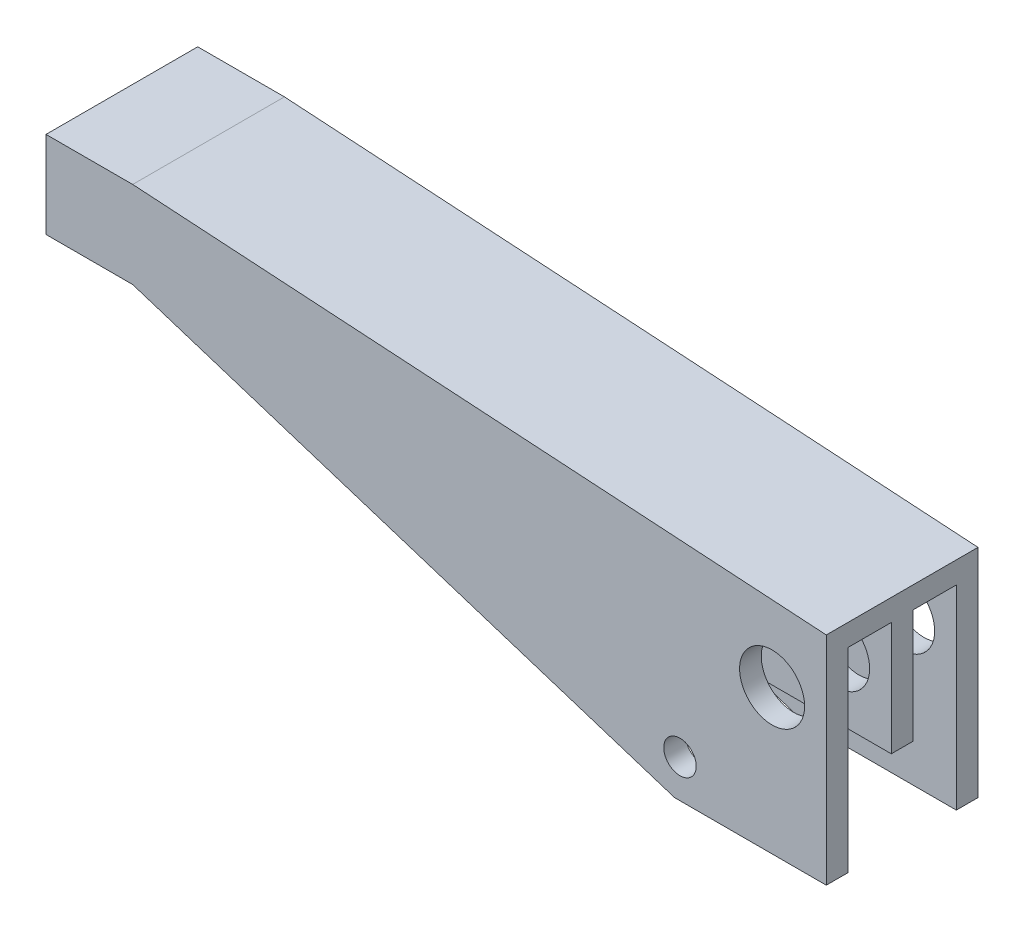
ISO-10303-21;
HEADER;
FILE_DESCRIPTION(('STEP AP214'),'2;1');
FILE_NAME('part.step','',(''),(''),'','','');
FILE_SCHEMA(('AUTOMOTIVE_DESIGN { 1 0 10303 214 1 1 1 1 }'));
ENDSEC;
DATA;
#1=APPLICATION_CONTEXT('core data for automotive mechanical design processes');
#2=APPLICATION_PROTOCOL_DEFINITION('international standard','automotive_design',2000,#1);
#3=PRODUCT_CONTEXT('',#1,'mechanical');
#4=PRODUCT('Part','Part','',(#3));
#5=PRODUCT_RELATED_PRODUCT_CATEGORY('part','',(#4));
#6=PRODUCT_DEFINITION_FORMATION('','',#4);
#7=PRODUCT_DEFINITION_CONTEXT('part definition',#1,'design');
#8=PRODUCT_DEFINITION('design','',#6,#7);
#9=PRODUCT_DEFINITION_SHAPE('','',#8);
#10=(LENGTH_UNIT() NAMED_UNIT(*) SI_UNIT(.MILLI.,.METRE.));
#11=(NAMED_UNIT(*) PLANE_ANGLE_UNIT() SI_UNIT($,.RADIAN.));
#12=(NAMED_UNIT(*) SI_UNIT($,.STERADIAN.) SOLID_ANGLE_UNIT());
#13=UNCERTAINTY_MEASURE_WITH_UNIT(LENGTH_MEASURE(1.E-05),#10,'distance_accuracy_value','');
#14=(GEOMETRIC_REPRESENTATION_CONTEXT(3) GLOBAL_UNCERTAINTY_ASSIGNED_CONTEXT((#13)) GLOBAL_UNIT_ASSIGNED_CONTEXT((#10,
#11,#12)) REPRESENTATION_CONTEXT('',''));
#15=CARTESIAN_POINT('',(0.,0.,0.));
#16=DIRECTION('',(0.,0.,1.));
#17=DIRECTION('',(1.,0.,0.));
#18=AXIS2_PLACEMENT_3D('',#15,#16,#17);
#19=CARTESIAN_POINT('',(-25.4,230.137938977263,-917.57362405213));
#20=DIRECTION('',(-0.0623782861551791,-0.998052578482889,0.));
#21=DIRECTION('',(0.998052578482889,-0.0623782861551791,0.));
#22=AXIS2_PLACEMENT_3D('',#19,#20,#21);
#23=PLANE('',#22);
#24=DIRECTION('',(0.,0.,1.));
#25=VECTOR('',#24,1.);
#26=CARTESIAN_POINT('',(0.,228.550438977263,-917.57362405213));
#27=LINE('',#26,#25);
#28=CARTESIAN_POINT('',(0.,228.550438977263,0.));
#29=VERTEX_POINT('',#28);
#30=CARTESIAN_POINT('',(0.,228.550438977263,50.8));
#31=VERTEX_POINT('',#30);
#32=EDGE_CURVE('E269',#29,#31,#27,.T.);
#33=ORIENTED_EDGE('',*,*,#32,.T.);
#34=DIRECTION('',(-0.998052578482889,0.0623782861551791,0.));
#35=VECTOR('',#34,1.);
#36=CARTESIAN_POINT('',(-25.4,230.137938977263,50.8));
#37=LINE('',#36,#35);
#38=CARTESIAN_POINT('',(-813.592976363787,279.4,50.8));
#39=VERTEX_POINT('',#38);
#40=EDGE_CURVE('E227',#31,#39,#37,.T.);
#41=ORIENTED_EDGE('',*,*,#40,.T.);
#42=DIRECTION('',(0.,0.,1.));
#43=VECTOR('',#42,1.);
#44=CARTESIAN_POINT('',(-813.592976363787,279.4,-917.57362405213));
#45=LINE('',#44,#43);
#46=CARTESIAN_POINT('',(-813.592976363787,279.4,0.));
#47=VERTEX_POINT('',#46);
#48=EDGE_CURVE('E287',#47,#39,#45,.T.);
#49=ORIENTED_EDGE('',*,*,#48,.F.);
#50=DIRECTION('',(-0.998052578482889,0.0623782861551791,0.));
#51=VECTOR('',#50,1.);
#52=CARTESIAN_POINT('',(-25.4,230.137938977263,0.));
#53=LINE('',#52,#51);
#54=EDGE_CURVE('E268',#29,#47,#53,.T.);
#55=ORIENTED_EDGE('',*,*,#54,.F.);
#56=EDGE_LOOP('',(#33,#41,#49,#55));
#57=FACE_BOUND('',#56,.T.);
#58=ADVANCED_FACE('F35',(#57),#23,.T.);
#59=CARTESIAN_POINT('',(-813.592976363787,279.4,-917.57362405213));
#60=DIRECTION('',(0.,-1.,0.));
#61=DIRECTION('',(1.,0.,0.));
#62=AXIS2_PLACEMENT_3D('',#59,#60,#61);
#63=PLANE('',#62);
#64=ORIENTED_EDGE('',*,*,#48,.T.);
#65=DIRECTION('',(-1.,0.,0.));
#66=VECTOR('',#65,1.);
#67=CARTESIAN_POINT('',(-813.592976363787,279.4,50.8));
#68=LINE('',#67,#66);
#69=CARTESIAN_POINT('',(-914.4,279.4,50.8));
#70=VERTEX_POINT('',#69);
#71=EDGE_CURVE('E225',#39,#70,#68,.T.);
#72=ORIENTED_EDGE('',*,*,#71,.T.);
#73=DIRECTION('',(0.,0.,1.));
#74=VECTOR('',#73,1.);
#75=CARTESIAN_POINT('',(-914.4,279.4,-917.57362405213));
#76=LINE('',#75,#74);
#77=CARTESIAN_POINT('',(-914.4,279.4,0.));
#78=VERTEX_POINT('',#77);
#79=EDGE_CURVE('E291',#78,#70,#76,.T.);
#80=ORIENTED_EDGE('',*,*,#79,.F.);
#81=DIRECTION('',(-1.,0.,0.));
#82=VECTOR('',#81,1.);
#83=CARTESIAN_POINT('',(-813.592976363787,279.4,0.));
#84=LINE('',#83,#82);
#85=EDGE_CURVE('E265',#47,#78,#84,.T.);
#86=ORIENTED_EDGE('',*,*,#85,.F.);
#87=EDGE_LOOP('',(#64,#72,#80,#86));
#88=FACE_BOUND('',#87,.T.);
#89=ADVANCED_FACE('F354',(#88),#63,.T.);
#90=DIRECTION('',(-0.998052578482889,0.0623782861551791,0.));
#91=VECTOR('',#90,1.);
#92=CARTESIAN_POINT('',(-25.4,230.137938977263,76.2));
#93=LINE('',#92,#91);
#94=CARTESIAN_POINT('',(0.,228.550438977263,76.1999999999999));
#95=VERTEX_POINT('',#94);
#96=CARTESIAN_POINT('',(-813.592976363787,279.4,76.2));
#97=VERTEX_POINT('',#96);
#98=EDGE_CURVE('E222',#95,#97,#93,.T.);
#99=ORIENTED_EDGE('',*,*,#98,.F.);
#100=CARTESIAN_POINT('',(0.,228.550438977263,127.));
#101=VERTEX_POINT('',#100);
#102=EDGE_CURVE('E286',#95,#101,#27,.T.);
#103=ORIENTED_EDGE('',*,*,#102,.T.);
#104=DIRECTION('',(-0.998052578482889,0.0623782861551791,0.));
#105=VECTOR('',#104,1.);
#106=CARTESIAN_POINT('',(-25.4,230.137938977263,127.));
#107=LINE('',#106,#105);
#108=CARTESIAN_POINT('',(-813.592976363787,279.4,127.));
#109=VERTEX_POINT('',#108);
#110=EDGE_CURVE('E261',#101,#109,#107,.T.);
#111=ORIENTED_EDGE('',*,*,#110,.T.);
#112=EDGE_CURVE('E290',#97,#109,#45,.T.);
#113=ORIENTED_EDGE('',*,*,#112,.F.);
#114=EDGE_LOOP('',(#99,#103,#111,#113));
#115=FACE_BOUND('',#114,.T.);
#116=ADVANCED_FACE('F409',(#115),#23,.T.);
#117=DIRECTION('',(-1.,0.,0.));
#118=VECTOR('',#117,1.);
#119=CARTESIAN_POINT('',(-813.592976363787,279.4,76.2));
#120=LINE('',#119,#118);
#121=CARTESIAN_POINT('',(-914.4,279.4,76.2));
#122=VERTEX_POINT('',#121);
#123=EDGE_CURVE('E59',#97,#122,#120,.T.);
#124=ORIENTED_EDGE('',*,*,#123,.F.);
#125=ORIENTED_EDGE('',*,*,#112,.T.);
#126=DIRECTION('',(-1.,0.,0.));
#127=VECTOR('',#126,1.);
#128=CARTESIAN_POINT('',(-813.592976363787,279.4,127.));
#129=LINE('',#128,#127);
#130=CARTESIAN_POINT('',(-914.4,279.4,127.));
#131=VERTEX_POINT('',#130);
#132=EDGE_CURVE('E11',#109,#131,#129,.T.);
#133=ORIENTED_EDGE('',*,*,#132,.T.);
#134=EDGE_CURVE('E283',#122,#131,#76,.T.);
#135=ORIENTED_EDGE('',*,*,#134,.F.);
#136=EDGE_LOOP('',(#124,#125,#133,#135));
#137=FACE_BOUND('',#136,.T.);
#138=ADVANCED_FACE('F401',(#137),#63,.T.);
#139=CARTESIAN_POINT('',(0.,0.,0.));
#140=DIRECTION('',(0.,0.,1.));
#141=DIRECTION('',(1.,0.,0.));
#142=AXIS2_PLACEMENT_3D('',#139,#140,#141);
#143=PLANE('',#142);
#144=CARTESIAN_POINT('',(-171.45,44.45,0.));
#145=DIRECTION('',(0.,0.,1.));
#146=DIRECTION('',(1.,0.,0.));
#147=AXIS2_PLACEMENT_3D('',#144,#145,#146);
#148=CIRCLE('',#147,19.05);
#149=CARTESIAN_POINT('',(-152.4,44.45,0.));
#150=VERTEX_POINT('',#149);
#151=EDGE_CURVE('E380',#150,#150,#148,.T.);
#152=ORIENTED_EDGE('',*,*,#151,.F.);
#153=EDGE_LOOP('',(#152));
#154=FACE_BOUND('',#153,.T.);
#155=CARTESIAN_POINT('',(-63.5,168.969627954527,0.));
#156=DIRECTION('',(0.,0.,1.));
#157=DIRECTION('',(1.,0.,0.));
#158=AXIS2_PLACEMENT_3D('',#155,#156,#157);
#159=CIRCLE('',#158,38.1);
#160=CARTESIAN_POINT('',(-25.4,168.969627954527,0.));
#161=VERTEX_POINT('',#160);
#162=EDGE_CURVE('E203',#161,#161,#159,.T.);
#163=ORIENTED_EDGE('',*,*,#162,.F.);
#164=EDGE_LOOP('',(#163));
#165=FACE_BOUND('',#164,.T.);
#166=DIRECTION('',(0.,1.,0.));
#167=VECTOR('',#166,1.);
#168=CARTESIAN_POINT('',(0.,0.,0.));
#169=LINE('',#168,#167);
#170=CARTESIAN_POINT('',(0.,0.,0.));
#171=VERTEX_POINT('',#170);
#172=EDGE_CURVE('E298',#171,#29,#169,.T.);
#173=ORIENTED_EDGE('',*,*,#172,.T.);
#174=ORIENTED_EDGE('',*,*,#54,.T.);
#175=ORIENTED_EDGE('',*,*,#85,.T.);
#176=DIRECTION('',(0.,-1.,0.));
#177=VECTOR('',#176,1.);
#178=CARTESIAN_POINT('',(-914.4,304.8,0.));
#179=LINE('',#178,#177);
#180=CARTESIAN_POINT('',(-914.4,203.2,0.));
#181=VERTEX_POINT('',#180);
#182=EDGE_CURVE('E272',#78,#181,#179,.T.);
#183=ORIENTED_EDGE('',*,*,#182,.T.);
#184=DIRECTION('',(1.,0.,0.));
#185=VECTOR('',#184,1.);
#186=CARTESIAN_POINT('',(-914.4,203.2,0.));
#187=LINE('',#186,#185);
#188=CARTESIAN_POINT('',(-812.8,203.2,0.));
#189=VERTEX_POINT('',#188);
#190=EDGE_CURVE('E318',#181,#189,#187,.T.);
#191=ORIENTED_EDGE('',*,*,#190,.T.);
#192=DIRECTION('',(0.952424147199324,-0.304775727103784,0.));
#193=VECTOR('',#192,1.);
#194=CARTESIAN_POINT('',(-812.8,203.2,0.));
#195=LINE('',#194,#193);
#196=CARTESIAN_POINT('',(-177.8,0.,0.));
#197=VERTEX_POINT('',#196);
#198=EDGE_CURVE('E321',#189,#197,#195,.T.);
#199=ORIENTED_EDGE('',*,*,#198,.T.);
#200=DIRECTION('',(1.,0.,0.));
#201=VECTOR('',#200,1.);
#202=CARTESIAN_POINT('',(-177.8,0.,0.));
#203=LINE('',#202,#201);
#204=EDGE_CURVE('E324',#197,#171,#203,.T.);
#205=ORIENTED_EDGE('',*,*,#204,.T.);
#206=EDGE_LOOP('',(#173,#174,#175,#183,#191,#199,#205));
#207=FACE_BOUND('',#206,.T.);
#208=ADVANCED_FACE('F351',(#154,#165,#207),#143,.T.);
#209=CARTESIAN_POINT('',(-914.4,304.8,-25.4));
#210=DIRECTION('',(-1.,0.,0.));
#211=DIRECTION('',(0.,0.,1.));
#212=AXIS2_PLACEMENT_3D('',#209,#210,#211);
#213=PLANE('',#212);
#214=DIRECTION('',(0.,-1.,0.));
#215=VECTOR('',#214,1.);
#216=CARTESIAN_POINT('',(-914.4,279.4,152.4));
#217=LINE('',#216,#215);
#218=CARTESIAN_POINT('',(-914.4,304.8,152.4));
#219=VERTEX_POINT('',#218);
#220=CARTESIAN_POINT('',(-914.4,203.2,152.4));
#221=VERTEX_POINT('',#220);
#222=EDGE_CURVE('E275',#219,#221,#217,.T.);
#223=ORIENTED_EDGE('',*,*,#222,.F.);
#224=DIRECTION('',(0.,0.,1.));
#225=VECTOR('',#224,1.);
#226=CARTESIAN_POINT('',(-914.4,304.8,-25.4));
#227=LINE('',#226,#225);
#228=CARTESIAN_POINT('',(-914.4,304.8,-25.4));
#229=VERTEX_POINT('',#228);
#230=EDGE_CURVE('E44',#229,#219,#227,.T.);
#231=ORIENTED_EDGE('',*,*,#230,.F.);
#232=DIRECTION('',(0.,-1.,0.));
#233=VECTOR('',#232,1.);
#234=CARTESIAN_POINT('',(-914.4,304.8,-25.4));
#235=LINE('',#234,#233);
#236=CARTESIAN_POINT('',(-914.4,203.2,-25.4));
#237=VERTEX_POINT('',#236);
#238=EDGE_CURVE('E294',#229,#237,#235,.T.);
#239=ORIENTED_EDGE('',*,*,#238,.T.);
#240=DIRECTION('',(0.,0.,1.));
#241=VECTOR('',#240,1.);
#242=CARTESIAN_POINT('',(-914.4,203.2,-25.4));
#243=LINE('',#242,#241);
#244=EDGE_CURVE('E316',#237,#181,#243,.T.);
#245=ORIENTED_EDGE('',*,*,#244,.T.);
#246=ORIENTED_EDGE('',*,*,#182,.F.);
#247=ORIENTED_EDGE('',*,*,#79,.T.);
#248=DIRECTION('',(0.,-1.,0.));
#249=VECTOR('',#248,1.);
#250=CARTESIAN_POINT('',(-914.4,304.8,50.8));
#251=LINE('',#250,#249);
#252=CARTESIAN_POINT('',(-914.4,203.2,50.8));
#253=VERTEX_POINT('',#252);
#254=EDGE_CURVE('E214',#70,#253,#251,.T.);
#255=ORIENTED_EDGE('',*,*,#254,.T.);
#256=DIRECTION('',(0.,0.,1.));
#257=VECTOR('',#256,1.);
#258=CARTESIAN_POINT('',(-914.4,203.2,50.8));
#259=LINE('',#258,#257);
#260=CARTESIAN_POINT('',(-914.4,203.2,76.2));
#261=VERTEX_POINT('',#260);
#262=EDGE_CURVE('E217',#253,#261,#259,.T.);
#263=ORIENTED_EDGE('',*,*,#262,.T.);
#264=DIRECTION('',(0.,-1.,0.));
#265=VECTOR('',#264,1.);
#266=CARTESIAN_POINT('',(-914.4,304.8,76.2));
#267=LINE('',#266,#265);
#268=EDGE_CURVE('E201',#122,#261,#267,.T.);
#269=ORIENTED_EDGE('',*,*,#268,.F.);
#270=ORIENTED_EDGE('',*,*,#134,.T.);
#271=DIRECTION('',(0.,-1.,0.));
#272=VECTOR('',#271,1.);
#273=CARTESIAN_POINT('',(-914.4,304.8,127.));
#274=LINE('',#273,#272);
#275=CARTESIAN_POINT('',(-914.4,203.2,127.));
#276=VERTEX_POINT('',#275);
#277=EDGE_CURVE('E234',#131,#276,#274,.T.);
#278=ORIENTED_EDGE('',*,*,#277,.T.);
#279=DIRECTION('',(0.,0.,-1.));
#280=VECTOR('',#279,1.);
#281=CARTESIAN_POINT('',(-914.4,203.2,152.4));
#282=LINE('',#281,#280);
#283=EDGE_CURVE('E239',#221,#276,#282,.T.);
#284=ORIENTED_EDGE('',*,*,#283,.F.);
#285=EDGE_LOOP('',(#223,#231,#239,#245,#246,#247,#255,#263,#269,#270,#278,#284));
#286=FACE_BOUND('',#285,.T.);
#287=ADVANCED_FACE('F37',(#286),#213,.T.);
#288=CARTESIAN_POINT('',(-914.4,304.8,-25.4));
#289=DIRECTION('',(0.,1.,0.));
#290=DIRECTION('',(-1.,0.,0.));
#291=AXIS2_PLACEMENT_3D('',#288,#289,#290);
#292=PLANE('',#291);
#293=DIRECTION('',(-1.,0.,0.));
#294=VECTOR('',#293,1.);
#295=CARTESIAN_POINT('',(-914.4,304.8,152.4));
#296=LINE('',#295,#294);
#297=CARTESIAN_POINT('',(-812.8,304.8,152.4));
#298=VERTEX_POINT('',#297);
#299=EDGE_CURVE('E264',#298,#219,#296,.T.);
#300=ORIENTED_EDGE('',*,*,#299,.F.);
#301=DIRECTION('',(0.,0.,1.));
#302=VECTOR('',#301,1.);
#303=CARTESIAN_POINT('',(-812.8,304.8,-25.4));
#304=LINE('',#303,#302);
#305=CARTESIAN_POINT('',(-812.8,304.8,-25.4));
#306=VERTEX_POINT('',#305);
#307=EDGE_CURVE('E330',#306,#298,#304,.T.);
#308=ORIENTED_EDGE('',*,*,#307,.F.);
#309=DIRECTION('',(-1.,0.,0.));
#310=VECTOR('',#309,1.);
#311=CARTESIAN_POINT('',(-914.4,304.8,-25.4));
#312=LINE('',#311,#310);
#313=EDGE_CURVE('E313',#306,#229,#312,.T.);
#314=ORIENTED_EDGE('',*,*,#313,.T.);
#315=ORIENTED_EDGE('',*,*,#230,.T.);
#316=EDGE_LOOP('',(#300,#308,#314,#315));
#317=FACE_BOUND('',#316,.T.);
#318=ADVANCED_FACE('F408',(#317),#292,.T.);
#319=CARTESIAN_POINT('',(0.,254.,-25.4));
#320=DIRECTION('',(0.0623782861551806,0.998052578482888,0.));
#321=DIRECTION('',(-0.998052578482889,0.0623782861551806,0.));
#322=AXIS2_PLACEMENT_3D('',#319,#320,#321);
#323=PLANE('',#322);
#324=DIRECTION('',(-0.998052578482889,0.0623782861551806,0.));
#325=VECTOR('',#324,1.);
#326=CARTESIAN_POINT('',(-812.8,304.8,152.4));
#327=LINE('',#326,#325);
#328=CARTESIAN_POINT('',(0.,254.,152.4));
#329=VERTEX_POINT('',#328);
#330=EDGE_CURVE('E280',#329,#298,#327,.T.);
#331=ORIENTED_EDGE('',*,*,#330,.F.);
#332=DIRECTION('',(0.,0.,1.));
#333=VECTOR('',#332,1.);
#334=CARTESIAN_POINT('',(0.,254.,-25.4));
#335=LINE('',#334,#333);
#336=CARTESIAN_POINT('',(0.,254.,-25.4));
#337=VERTEX_POINT('',#336);
#338=EDGE_CURVE('E332',#337,#329,#335,.T.);
#339=ORIENTED_EDGE('',*,*,#338,.F.);
#340=DIRECTION('',(-0.998052578482889,0.0623782861551806,0.));
#341=VECTOR('',#340,1.);
#342=CARTESIAN_POINT('',(0.,254.,-25.4));
#343=LINE('',#342,#341);
#344=EDGE_CURVE('E310',#337,#306,#343,.T.);
#345=ORIENTED_EDGE('',*,*,#344,.T.);
#346=ORIENTED_EDGE('',*,*,#307,.T.);
#347=EDGE_LOOP('',(#331,#339,#345,#346));
#348=FACE_BOUND('',#347,.T.);
#349=ADVANCED_FACE('F457',(#348),#323,.T.);
#350=CARTESIAN_POINT('',(0.,0.,-25.4));
#351=DIRECTION('',(1.,0.,0.));
#352=DIRECTION('',(0.,0.,-1.));
#353=AXIS2_PLACEMENT_3D('',#350,#351,#352);
#354=PLANE('',#353);
#355=DIRECTION('',(0.,0.,1.));
#356=VECTOR('',#355,1.);
#357=CARTESIAN_POINT('',(0.,95.25,-434.103297745089));
#358=LINE('',#357,#356);
#359=CARTESIAN_POINT('',(0.,95.25,50.8));
#360=VERTEX_POINT('',#359);
#361=CARTESIAN_POINT('',(0.,95.25,76.2));
#362=VERTEX_POINT('',#361);
#363=EDGE_CURVE('E51',#360,#362,#358,.T.);
#364=ORIENTED_EDGE('',*,*,#363,.F.);
#365=DIRECTION('',(0.,1.,0.));
#366=VECTOR('',#365,1.);
#367=CARTESIAN_POINT('',(0.,0.,50.8));
#368=LINE('',#367,#366);
#369=EDGE_CURVE('E212',#360,#31,#368,.T.);
#370=ORIENTED_EDGE('',*,*,#369,.T.);
#371=ORIENTED_EDGE('',*,*,#32,.F.);
#372=ORIENTED_EDGE('',*,*,#172,.F.);
#373=DIRECTION('',(0.,0.,1.));
#374=VECTOR('',#373,1.);
#375=CARTESIAN_POINT('',(0.,0.,-25.4));
#376=LINE('',#375,#374);
#377=CARTESIAN_POINT('',(0.,0.,-25.4));
#378=VERTEX_POINT('',#377);
#379=EDGE_CURVE('E334',#378,#171,#376,.T.);
#380=ORIENTED_EDGE('',*,*,#379,.F.);
#381=DIRECTION('',(0.,1.,0.));
#382=VECTOR('',#381,1.);
#383=CARTESIAN_POINT('',(0.,0.,-25.4));
#384=LINE('',#383,#382);
#385=EDGE_CURVE('E307',#378,#337,#384,.T.);
#386=ORIENTED_EDGE('',*,*,#385,.T.);
#387=ORIENTED_EDGE('',*,*,#338,.T.);
#388=DIRECTION('',(0.,1.,0.));
#389=VECTOR('',#388,1.);
#390=CARTESIAN_POINT('',(0.,228.550438977263,152.4));
#391=LINE('',#390,#389);
#392=CARTESIAN_POINT('',(0.,0.,152.4));
#393=VERTEX_POINT('',#392);
#394=EDGE_CURVE('E277',#393,#329,#391,.T.);
#395=ORIENTED_EDGE('',*,*,#394,.F.);
#396=DIRECTION('',(0.,0.,-1.));
#397=VECTOR('',#396,1.);
#398=CARTESIAN_POINT('',(0.,0.,152.4));
#399=LINE('',#398,#397);
#400=CARTESIAN_POINT('',(0.,0.,127.));
#401=VERTEX_POINT('',#400);
#402=EDGE_CURVE('E252',#393,#401,#399,.T.);
#403=ORIENTED_EDGE('',*,*,#402,.T.);
#404=DIRECTION('',(0.,1.,0.));
#405=VECTOR('',#404,1.);
#406=CARTESIAN_POINT('',(0.,0.,127.));
#407=LINE('',#406,#405);
#408=EDGE_CURVE('E246',#401,#101,#407,.T.);
#409=ORIENTED_EDGE('',*,*,#408,.T.);
#410=ORIENTED_EDGE('',*,*,#102,.F.);
#411=DIRECTION('',(0.,1.,0.));
#412=VECTOR('',#411,1.);
#413=CARTESIAN_POINT('',(0.,0.,76.2));
#414=LINE('',#413,#412);
#415=EDGE_CURVE('E199',#362,#95,#414,.T.);
#416=ORIENTED_EDGE('',*,*,#415,.F.);
#417=EDGE_LOOP('',(#364,#370,#371,#372,#380,#386,#387,#395,#403,#409,#410,#416));
#418=FACE_BOUND('',#417,.T.);
#419=ADVANCED_FACE('F428',(#418),#354,.T.);
#420=CARTESIAN_POINT('',(-177.8,0.,-25.4));
#421=DIRECTION('',(0.,-1.,0.));
#422=DIRECTION('',(0.,0.,-1.));
#423=AXIS2_PLACEMENT_3D('',#420,#421,#422);
#424=PLANE('',#423);
#425=ORIENTED_EDGE('',*,*,#204,.F.);
#426=DIRECTION('',(0.,0.,1.));
#427=VECTOR('',#426,1.);
#428=CARTESIAN_POINT('',(-177.8,0.,-25.4));
#429=LINE('',#428,#427);
#430=CARTESIAN_POINT('',(-177.8,0.,-25.4));
#431=VERTEX_POINT('',#430);
#432=EDGE_CURVE('E336',#431,#197,#429,.T.);
#433=ORIENTED_EDGE('',*,*,#432,.F.);
#434=DIRECTION('',(1.,0.,0.));
#435=VECTOR('',#434,1.);
#436=CARTESIAN_POINT('',(-177.8,0.,-25.4));
#437=LINE('',#436,#435);
#438=EDGE_CURVE('E304',#431,#378,#437,.T.);
#439=ORIENTED_EDGE('',*,*,#438,.T.);
#440=ORIENTED_EDGE('',*,*,#379,.T.);
#441=EDGE_LOOP('',(#425,#433,#439,#440));
#442=FACE_BOUND('',#441,.T.);
#443=ADVANCED_FACE('F463',(#442),#424,.T.);
#444=CARTESIAN_POINT('',(-812.8,203.2,-25.4));
#445=DIRECTION('',(-0.304775727103784,-0.952424147199324,0.));
#446=DIRECTION('',(0.952424147199324,-0.304775727103784,0.));
#447=AXIS2_PLACEMENT_3D('',#444,#445,#446);
#448=PLANE('',#447);
#449=ORIENTED_EDGE('',*,*,#198,.F.);
#450=DIRECTION('',(0.,0.,1.));
#451=VECTOR('',#450,1.);
#452=CARTESIAN_POINT('',(-812.8,203.2,-25.4));
#453=LINE('',#452,#451);
#454=CARTESIAN_POINT('',(-812.8,203.2,-25.4));
#455=VERTEX_POINT('',#454);
#456=EDGE_CURVE('E338',#455,#189,#453,.T.);
#457=ORIENTED_EDGE('',*,*,#456,.F.);
#458=DIRECTION('',(0.952424147199324,-0.304775727103784,0.));
#459=VECTOR('',#458,1.);
#460=CARTESIAN_POINT('',(-812.8,203.2,-25.4));
#461=LINE('',#460,#459);
#462=EDGE_CURVE('E301',#455,#431,#461,.T.);
#463=ORIENTED_EDGE('',*,*,#462,.T.);
#464=ORIENTED_EDGE('',*,*,#432,.T.);
#465=EDGE_LOOP('',(#449,#457,#463,#464));
#466=FACE_BOUND('',#465,.T.);
#467=ADVANCED_FACE('F465',(#466),#448,.T.);
#468=CARTESIAN_POINT('',(-914.4,203.2,-25.4));
#469=DIRECTION('',(0.,-1.,0.));
#470=DIRECTION('',(0.,0.,-1.));
#471=AXIS2_PLACEMENT_3D('',#468,#469,#470);
#472=PLANE('',#471);
#473=ORIENTED_EDGE('',*,*,#190,.F.);
#474=ORIENTED_EDGE('',*,*,#244,.F.);
#475=DIRECTION('',(1.,0.,0.));
#476=VECTOR('',#475,1.);
#477=CARTESIAN_POINT('',(-914.4,203.2,-25.4));
#478=LINE('',#477,#476);
#479=EDGE_CURVE('E297',#237,#455,#478,.T.);
#480=ORIENTED_EDGE('',*,*,#479,.T.);
#481=ORIENTED_EDGE('',*,*,#456,.T.);
#482=EDGE_LOOP('',(#473,#474,#480,#481));
#483=FACE_BOUND('',#482,.T.);
#484=ADVANCED_FACE('F348',(#483),#472,.T.);
#485=CARTESIAN_POINT('',(0.,0.,-25.4));
#486=DIRECTION('',(0.,0.,1.));
#487=DIRECTION('',(1.,0.,0.));
#488=AXIS2_PLACEMENT_3D('',#485,#486,#487);
#489=PLANE('',#488);
#490=CARTESIAN_POINT('',(-171.45,44.45,-25.4));
#491=DIRECTION('',(0.,0.,1.));
#492=DIRECTION('',(1.,0.,0.));
#493=AXIS2_PLACEMENT_3D('',#490,#491,#492);
#494=CIRCLE('',#493,19.05);
#495=CARTESIAN_POINT('',(-152.4,44.45,-25.4));
#496=VERTEX_POINT('',#495);
#497=EDGE_CURVE('E371',#496,#496,#494,.T.);
#498=ORIENTED_EDGE('',*,*,#497,.T.);
#499=EDGE_LOOP('',(#498));
#500=FACE_BOUND('',#499,.T.);
#501=CARTESIAN_POINT('',(-63.5,168.969627954527,-25.4));
#502=DIRECTION('',(0.,0.,1.));
#503=DIRECTION('',(1.,0.,0.));
#504=AXIS2_PLACEMENT_3D('',#501,#502,#503);
#505=CIRCLE('',#504,38.1);
#506=CARTESIAN_POINT('',(-25.4,168.969627954527,-25.4));
#507=VERTEX_POINT('',#506);
#508=EDGE_CURVE('E384',#507,#507,#505,.T.);
#509=ORIENTED_EDGE('',*,*,#508,.T.);
#510=EDGE_LOOP('',(#509));
#511=FACE_BOUND('',#510,.T.);
#512=ORIENTED_EDGE('',*,*,#238,.F.);
#513=ORIENTED_EDGE('',*,*,#313,.F.);
#514=ORIENTED_EDGE('',*,*,#344,.F.);
#515=ORIENTED_EDGE('',*,*,#385,.F.);
#516=ORIENTED_EDGE('',*,*,#438,.F.);
#517=ORIENTED_EDGE('',*,*,#462,.F.);
#518=ORIENTED_EDGE('',*,*,#479,.F.);
#519=EDGE_LOOP('',(#512,#513,#514,#515,#516,#517,#518));
#520=FACE_BOUND('',#519,.T.);
#521=ADVANCED_FACE('F452',(#500,#511,#520),#489,.F.);
#522=CARTESIAN_POINT('',(0.,0.,152.4));
#523=DIRECTION('',(0.,0.,1.));
#524=DIRECTION('',(1.,0.,0.));
#525=AXIS2_PLACEMENT_3D('',#522,#523,#524);
#526=PLANE('',#525);
#527=CARTESIAN_POINT('',(-171.45,44.45,152.4));
#528=DIRECTION('',(0.,0.,1.));
#529=DIRECTION('',(1.,0.,0.));
#530=AXIS2_PLACEMENT_3D('',#527,#528,#529);
#531=CIRCLE('',#530,19.05);
#532=CARTESIAN_POINT('',(-152.4,44.45,152.4));
#533=VERTEX_POINT('',#532);
#534=EDGE_CURVE('E368',#533,#533,#531,.T.);
#535=ORIENTED_EDGE('',*,*,#534,.F.);
#536=EDGE_LOOP('',(#535));
#537=FACE_BOUND('',#536,.T.);
#538=CARTESIAN_POINT('',(-63.5,168.969627954527,152.4));
#539=DIRECTION('',(0.,0.,1.));
#540=DIRECTION('',(1.,0.,0.));
#541=AXIS2_PLACEMENT_3D('',#538,#539,#540);
#542=CIRCLE('',#541,38.1);
#543=CARTESIAN_POINT('',(-25.4,168.969627954527,152.4));
#544=VERTEX_POINT('',#543);
#545=EDGE_CURVE('E383',#544,#544,#542,.T.);
#546=ORIENTED_EDGE('',*,*,#545,.F.);
#547=EDGE_LOOP('',(#546));
#548=FACE_BOUND('',#547,.T.);
#549=DIRECTION('',(1.,0.,0.));
#550=VECTOR('',#549,1.);
#551=CARTESIAN_POINT('',(-177.8,0.,152.4));
#552=LINE('',#551,#550);
#553=CARTESIAN_POINT('',(-177.8,0.,152.4));
#554=VERTEX_POINT('',#553);
#555=EDGE_CURVE('E236',#554,#393,#552,.T.);
#556=ORIENTED_EDGE('',*,*,#555,.T.);
#557=ORIENTED_EDGE('',*,*,#394,.T.);
#558=ORIENTED_EDGE('',*,*,#330,.T.);
#559=ORIENTED_EDGE('',*,*,#299,.T.);
#560=ORIENTED_EDGE('',*,*,#222,.T.);
#561=DIRECTION('',(1.,0.,0.));
#562=VECTOR('',#561,1.);
#563=CARTESIAN_POINT('',(-914.4,203.2,152.4));
#564=LINE('',#563,#562);
#565=CARTESIAN_POINT('',(-812.8,203.2,152.4));
#566=VERTEX_POINT('',#565);
#567=EDGE_CURVE('E230',#221,#566,#564,.T.);
#568=ORIENTED_EDGE('',*,*,#567,.T.);
#569=DIRECTION('',(0.952424147199324,-0.304775727103784,0.));
#570=VECTOR('',#569,1.);
#571=CARTESIAN_POINT('',(-812.8,203.2,152.4));
#572=LINE('',#571,#570);
#573=EDGE_CURVE('E233',#566,#554,#572,.T.);
#574=ORIENTED_EDGE('',*,*,#573,.T.);
#575=EDGE_LOOP('',(#556,#557,#558,#559,#560,#568,#574));
#576=FACE_BOUND('',#575,.T.);
#577=ADVANCED_FACE('F447',(#537,#548,#576),#526,.T.);
#578=CARTESIAN_POINT('',(-914.4,203.2,152.4));
#579=DIRECTION('',(0.,1.,0.));
#580=DIRECTION('',(0.,0.,1.));
#581=AXIS2_PLACEMENT_3D('',#578,#579,#580);
#582=PLANE('',#581);
#583=DIRECTION('',(1.,0.,0.));
#584=VECTOR('',#583,1.);
#585=CARTESIAN_POINT('',(-914.4,203.2,127.));
#586=LINE('',#585,#584);
#587=CARTESIAN_POINT('',(-812.8,203.2,127.));
#588=VERTEX_POINT('',#587);
#589=EDGE_CURVE('E229',#276,#588,#586,.T.);
#590=ORIENTED_EDGE('',*,*,#589,.T.);
#591=DIRECTION('',(0.,0.,-1.));
#592=VECTOR('',#591,1.);
#593=CARTESIAN_POINT('',(-812.8,203.2,152.4));
#594=LINE('',#593,#592);
#595=EDGE_CURVE('E258',#566,#588,#594,.T.);
#596=ORIENTED_EDGE('',*,*,#595,.F.);
#597=ORIENTED_EDGE('',*,*,#567,.F.);
#598=ORIENTED_EDGE('',*,*,#283,.T.);
#599=EDGE_LOOP('',(#590,#596,#597,#598));
#600=FACE_BOUND('',#599,.T.);
#601=ADVANCED_FACE('F440',(#600),#582,.F.);
#602=CARTESIAN_POINT('',(-812.8,203.2,152.4));
#603=DIRECTION('',(0.304775727103784,0.952424147199324,0.));
#604=DIRECTION('',(-0.952424147199324,0.304775727103784,0.));
#605=AXIS2_PLACEMENT_3D('',#602,#603,#604);
#606=PLANE('',#605);
#607=DIRECTION('',(0.952424147199324,-0.304775727103784,0.));
#608=VECTOR('',#607,1.);
#609=CARTESIAN_POINT('',(-812.8,203.2,127.));
#610=LINE('',#609,#608);
#611=CARTESIAN_POINT('',(-177.8,0.,127.));
#612=VERTEX_POINT('',#611);
#613=EDGE_CURVE('E242',#588,#612,#610,.T.);
#614=ORIENTED_EDGE('',*,*,#613,.T.);
#615=DIRECTION('',(0.,0.,-1.));
#616=VECTOR('',#615,1.);
#617=CARTESIAN_POINT('',(-177.8,0.,152.4));
#618=LINE('',#617,#616);
#619=EDGE_CURVE('E255',#554,#612,#618,.T.);
#620=ORIENTED_EDGE('',*,*,#619,.F.);
#621=ORIENTED_EDGE('',*,*,#573,.F.);
#622=ORIENTED_EDGE('',*,*,#595,.T.);
#623=EDGE_LOOP('',(#614,#620,#621,#622));
#624=FACE_BOUND('',#623,.T.);
#625=ADVANCED_FACE('F444',(#624),#606,.F.);
#626=CARTESIAN_POINT('',(-177.8,0.,152.4));
#627=DIRECTION('',(0.,1.,0.));
#628=DIRECTION('',(0.,0.,1.));
#629=AXIS2_PLACEMENT_3D('',#626,#627,#628);
#630=PLANE('',#629);
#631=DIRECTION('',(1.,0.,0.));
#632=VECTOR('',#631,1.);
#633=CARTESIAN_POINT('',(-177.8,0.,127.));
#634=LINE('',#633,#632);
#635=EDGE_CURVE('E244',#612,#401,#634,.T.);
#636=ORIENTED_EDGE('',*,*,#635,.T.);
#637=ORIENTED_EDGE('',*,*,#402,.F.);
#638=ORIENTED_EDGE('',*,*,#555,.F.);
#639=ORIENTED_EDGE('',*,*,#619,.T.);
#640=EDGE_LOOP('',(#636,#637,#638,#639));
#641=FACE_BOUND('',#640,.T.);
#642=ADVANCED_FACE('F529',(#641),#630,.F.);
#643=CARTESIAN_POINT('',(0.,0.,127.));
#644=DIRECTION('',(0.,0.,1.));
#645=DIRECTION('',(1.,0.,0.));
#646=AXIS2_PLACEMENT_3D('',#643,#644,#645);
#647=PLANE('',#646);
#648=CARTESIAN_POINT('',(-171.45,44.45,127.));
#649=DIRECTION('',(0.,0.,1.));
#650=DIRECTION('',(1.,0.,0.));
#651=AXIS2_PLACEMENT_3D('',#648,#649,#650);
#652=CIRCLE('',#651,19.05);
#653=CARTESIAN_POINT('',(-152.4,44.45,127.));
#654=VERTEX_POINT('',#653);
#655=EDGE_CURVE('E376',#654,#654,#652,.T.);
#656=ORIENTED_EDGE('',*,*,#655,.T.);
#657=EDGE_LOOP('',(#656));
#658=FACE_BOUND('',#657,.T.);
#659=CARTESIAN_POINT('',(-63.5,168.969627954527,127.));
#660=DIRECTION('',(0.,0.,1.));
#661=DIRECTION('',(1.,0.,0.));
#662=AXIS2_PLACEMENT_3D('',#659,#660,#661);
#663=CIRCLE('',#662,38.1);
#664=CARTESIAN_POINT('',(-25.4,168.969627954527,127.));
#665=VERTEX_POINT('',#664);
#666=EDGE_CURVE('E392',#665,#665,#663,.T.);
#667=ORIENTED_EDGE('',*,*,#666,.T.);
#668=EDGE_LOOP('',(#667));
#669=FACE_BOUND('',#668,.T.);
#670=ORIENTED_EDGE('',*,*,#110,.F.);
#671=ORIENTED_EDGE('',*,*,#408,.F.);
#672=ORIENTED_EDGE('',*,*,#635,.F.);
#673=ORIENTED_EDGE('',*,*,#613,.F.);
#674=ORIENTED_EDGE('',*,*,#589,.F.);
#675=ORIENTED_EDGE('',*,*,#277,.F.);
#676=ORIENTED_EDGE('',*,*,#132,.F.);
#677=EDGE_LOOP('',(#670,#671,#672,#673,#674,#675,#676));
#678=FACE_BOUND('',#677,.T.);
#679=ADVANCED_FACE('F433',(#658,#669,#678),#647,.F.);
#680=CARTESIAN_POINT('',(-914.4,203.2,50.8));
#681=DIRECTION('',(0.,-1.,0.));
#682=DIRECTION('',(0.,0.,-1.));
#683=AXIS2_PLACEMENT_3D('',#680,#681,#682);
#684=PLANE('',#683);
#685=DIRECTION('',(0.,0.,1.));
#686=VECTOR('',#685,1.);
#687=CARTESIAN_POINT('',(-812.8,203.2,50.8));
#688=LINE('',#687,#686);
#689=CARTESIAN_POINT('',(-812.8,203.2,50.8));
#690=VERTEX_POINT('',#689);
#691=CARTESIAN_POINT('',(-812.8,203.2,76.2));
#692=VERTEX_POINT('',#691);
#693=EDGE_CURVE('E216',#690,#692,#688,.T.);
#694=ORIENTED_EDGE('',*,*,#693,.T.);
#695=DIRECTION('',(1.,0.,0.));
#696=VECTOR('',#695,1.);
#697=CARTESIAN_POINT('',(-914.4,203.2,76.2));
#698=LINE('',#697,#696);
#699=EDGE_CURVE('E198',#261,#692,#698,.T.);
#700=ORIENTED_EDGE('',*,*,#699,.F.);
#701=ORIENTED_EDGE('',*,*,#262,.F.);
#702=DIRECTION('',(1.,0.,0.));
#703=VECTOR('',#702,1.);
#704=CARTESIAN_POINT('',(-914.4,203.2,50.8));
#705=LINE('',#704,#703);
#706=EDGE_CURVE('E208',#253,#690,#705,.T.);
#707=ORIENTED_EDGE('',*,*,#706,.T.);
#708=EDGE_LOOP('',(#694,#700,#701,#707));
#709=FACE_BOUND('',#708,.T.);
#710=ADVANCED_FACE('F367',(#709),#684,.T.);
#711=CARTESIAN_POINT('',(-812.8,203.2,50.8));
#712=DIRECTION('',(-0.304775727103784,-0.952424147199324,0.));
#713=DIRECTION('',(0.952424147199324,-0.304775727103784,0.));
#714=AXIS2_PLACEMENT_3D('',#711,#712,#713);
#715=PLANE('',#714);
#716=DIRECTION('',(0.,0.,1.));
#717=VECTOR('',#716,1.);
#718=CARTESIAN_POINT('',(-475.45625,95.25,-434.103297745089));
#719=LINE('',#718,#717);
#720=CARTESIAN_POINT('',(-475.45625,95.25,50.8));
#721=VERTEX_POINT('',#720);
#722=CARTESIAN_POINT('',(-475.45625,95.25,76.2));
#723=VERTEX_POINT('',#722);
#724=EDGE_CURVE('E179',#721,#723,#719,.T.);
#725=ORIENTED_EDGE('',*,*,#724,.T.);
#726=DIRECTION('',(0.952424147199324,-0.304775727103784,0.));
#727=VECTOR('',#726,1.);
#728=CARTESIAN_POINT('',(-812.8,203.2,76.2));
#729=LINE('',#728,#727);
#730=EDGE_CURVE('E189',#692,#723,#729,.T.);
#731=ORIENTED_EDGE('',*,*,#730,.F.);
#732=ORIENTED_EDGE('',*,*,#693,.F.);
#733=DIRECTION('',(0.952424147199324,-0.304775727103784,0.));
#734=VECTOR('',#733,1.);
#735=CARTESIAN_POINT('',(-812.8,203.2,50.8));
#736=LINE('',#735,#734);
#737=EDGE_CURVE('E192',#690,#721,#736,.T.);
#738=ORIENTED_EDGE('',*,*,#737,.T.);
#739=EDGE_LOOP('',(#725,#731,#732,#738));
#740=FACE_BOUND('',#739,.T.);
#741=ADVANCED_FACE('F188',(#740),#715,.T.);
#742=CARTESIAN_POINT('',(0.,0.,50.8));
#743=DIRECTION('',(0.,0.,1.));
#744=DIRECTION('',(1.,0.,0.));
#745=AXIS2_PLACEMENT_3D('',#742,#743,#744);
#746=PLANE('',#745);
#747=CARTESIAN_POINT('',(-63.5,168.969627954527,50.8));
#748=DIRECTION('',(0.,0.,1.));
#749=DIRECTION('',(1.,0.,0.));
#750=AXIS2_PLACEMENT_3D('',#747,#748,#749);
#751=CIRCLE('',#750,38.1);
#752=CARTESIAN_POINT('',(-25.4,168.969627954527,50.8));
#753=VERTEX_POINT('',#752);
#754=EDGE_CURVE('E389',#753,#753,#751,.T.);
#755=ORIENTED_EDGE('',*,*,#754,.T.);
#756=EDGE_LOOP('',(#755));
#757=FACE_BOUND('',#756,.T.);
#758=ORIENTED_EDGE('',*,*,#369,.F.);
#759=DIRECTION('',(1.,0.,0.));
#760=VECTOR('',#759,1.);
#761=CARTESIAN_POINT('',(-475.45625,95.25,50.8));
#762=LINE('',#761,#760);
#763=EDGE_CURVE('E193',#721,#360,#762,.T.);
#764=ORIENTED_EDGE('',*,*,#763,.F.);
#765=ORIENTED_EDGE('',*,*,#737,.F.);
#766=ORIENTED_EDGE('',*,*,#706,.F.);
#767=ORIENTED_EDGE('',*,*,#254,.F.);
#768=ORIENTED_EDGE('',*,*,#71,.F.);
#769=ORIENTED_EDGE('',*,*,#40,.F.);
#770=EDGE_LOOP('',(#758,#764,#765,#766,#767,#768,#769));
#771=FACE_BOUND('',#770,.T.);
#772=ADVANCED_FACE('F361',(#757,#771),#746,.F.);
#773=CARTESIAN_POINT('',(0.,0.,76.2));
#774=DIRECTION('',(0.,0.,1.));
#775=DIRECTION('',(1.,0.,0.));
#776=AXIS2_PLACEMENT_3D('',#773,#774,#775);
#777=PLANE('',#776);
#778=DIRECTION('',(-1.,0.,0.));
#779=VECTOR('',#778,1.);
#780=CARTESIAN_POINT('',(-475.45625,95.25,76.2));
#781=LINE('',#780,#779);
#782=EDGE_CURVE('E176',#362,#723,#781,.T.);
#783=ORIENTED_EDGE('',*,*,#782,.F.);
#784=ORIENTED_EDGE('',*,*,#415,.T.);
#785=ORIENTED_EDGE('',*,*,#98,.T.);
#786=ORIENTED_EDGE('',*,*,#123,.T.);
#787=ORIENTED_EDGE('',*,*,#268,.T.);
#788=ORIENTED_EDGE('',*,*,#699,.T.);
#789=ORIENTED_EDGE('',*,*,#730,.T.);
#790=EDGE_LOOP('',(#783,#784,#785,#786,#787,#788,#789));
#791=FACE_BOUND('',#790,.T.);
#792=CARTESIAN_POINT('',(-63.5,168.969627954527,76.2));
#793=DIRECTION('',(0.,0.,1.));
#794=DIRECTION('',(1.,0.,0.));
#795=AXIS2_PLACEMENT_3D('',#792,#793,#794);
#796=CIRCLE('',#795,38.1);
#797=CARTESIAN_POINT('',(-25.4,168.969627954527,76.2));
#798=VERTEX_POINT('',#797);
#799=EDGE_CURVE('E39',#798,#798,#796,.T.);
#800=ORIENTED_EDGE('',*,*,#799,.F.);
#801=EDGE_LOOP('',(#800));
#802=FACE_BOUND('',#801,.T.);
#803=ADVANCED_FACE('F195',(#791,#802),#777,.T.);
#804=CARTESIAN_POINT('',(-63.5,168.969627954527,-25.4));
#805=DIRECTION('',(0.,0.,1.));
#806=DIRECTION('',(1.,0.,0.));
#807=AXIS2_PLACEMENT_3D('',#804,#805,#806);
#808=CYLINDRICAL_SURFACE('',#807,38.1);
#809=ORIENTED_EDGE('',*,*,#799,.T.);
#810=EDGE_LOOP('',(#809));
#811=FACE_BOUND('',#810,.T.);
#812=ORIENTED_EDGE('',*,*,#754,.F.);
#813=EDGE_LOOP('',(#812));
#814=FACE_BOUND('',#813,.T.);
#815=ADVANCED_FACE('F607',(#811,#814),#808,.F.);
#816=ORIENTED_EDGE('',*,*,#545,.T.);
#817=EDGE_LOOP('',(#816));
#818=FACE_BOUND('',#817,.T.);
#819=ORIENTED_EDGE('',*,*,#666,.F.);
#820=EDGE_LOOP('',(#819));
#821=FACE_BOUND('',#820,.T.);
#822=ADVANCED_FACE('F616',(#818,#821),#808,.F.);
#823=ORIENTED_EDGE('',*,*,#162,.T.);
#824=EDGE_LOOP('',(#823));
#825=FACE_BOUND('',#824,.T.);
#826=ORIENTED_EDGE('',*,*,#508,.F.);
#827=EDGE_LOOP('',(#826));
#828=FACE_BOUND('',#827,.T.);
#829=ADVANCED_FACE('F397',(#825,#828),#808,.F.);
#830=CARTESIAN_POINT('',(-171.45,44.45,-25.4));
#831=DIRECTION('',(0.,0.,1.));
#832=DIRECTION('',(1.,0.,0.));
#833=AXIS2_PLACEMENT_3D('',#830,#831,#832);
#834=CYLINDRICAL_SURFACE('',#833,19.05);
#835=ORIENTED_EDGE('',*,*,#534,.T.);
#836=EDGE_LOOP('',(#835));
#837=FACE_BOUND('',#836,.T.);
#838=ORIENTED_EDGE('',*,*,#655,.F.);
#839=EDGE_LOOP('',(#838));
#840=FACE_BOUND('',#839,.T.);
#841=ADVANCED_FACE('F633',(#837,#840),#834,.F.);
#842=ORIENTED_EDGE('',*,*,#151,.T.);
#843=EDGE_LOOP('',(#842));
#844=FACE_BOUND('',#843,.T.);
#845=ORIENTED_EDGE('',*,*,#497,.F.);
#846=EDGE_LOOP('',(#845));
#847=FACE_BOUND('',#846,.T.);
#848=ADVANCED_FACE('F640',(#844,#847),#834,.F.);
#849=CARTESIAN_POINT('',(-475.45625,95.25,-434.103297745089));
#850=DIRECTION('',(0.,1.,0.));
#851=DIRECTION('',(0.,0.,1.));
#852=AXIS2_PLACEMENT_3D('',#849,#850,#851);
#853=PLANE('',#852);
#854=ORIENTED_EDGE('',*,*,#763,.T.);
#855=ORIENTED_EDGE('',*,*,#363,.T.);
#856=ORIENTED_EDGE('',*,*,#782,.T.);
#857=ORIENTED_EDGE('',*,*,#724,.F.);
#858=EDGE_LOOP('',(#854,#855,#856,#857));
#859=FACE_BOUND('',#858,.T.);
#860=ADVANCED_FACE('F178',(#859),#853,.F.);
#861=CLOSED_SHELL('',(#58,#89,#116,#138,#208,#287,#318,#349,#419,#443,#467,#484,#521,#577,#601,
#625,#642,#679,#710,#741,#772,#803,#815,#822,#829,#841,#848,#860));
#862=MANIFOLD_SOLID_BREP('B2',#861);
#863=ADVANCED_BREP_SHAPE_REPRESENTATION('',(#18,#862),#14);
#864=SHAPE_DEFINITION_REPRESENTATION(#9,#863);
ENDSEC;
END-ISO-10303-21;
